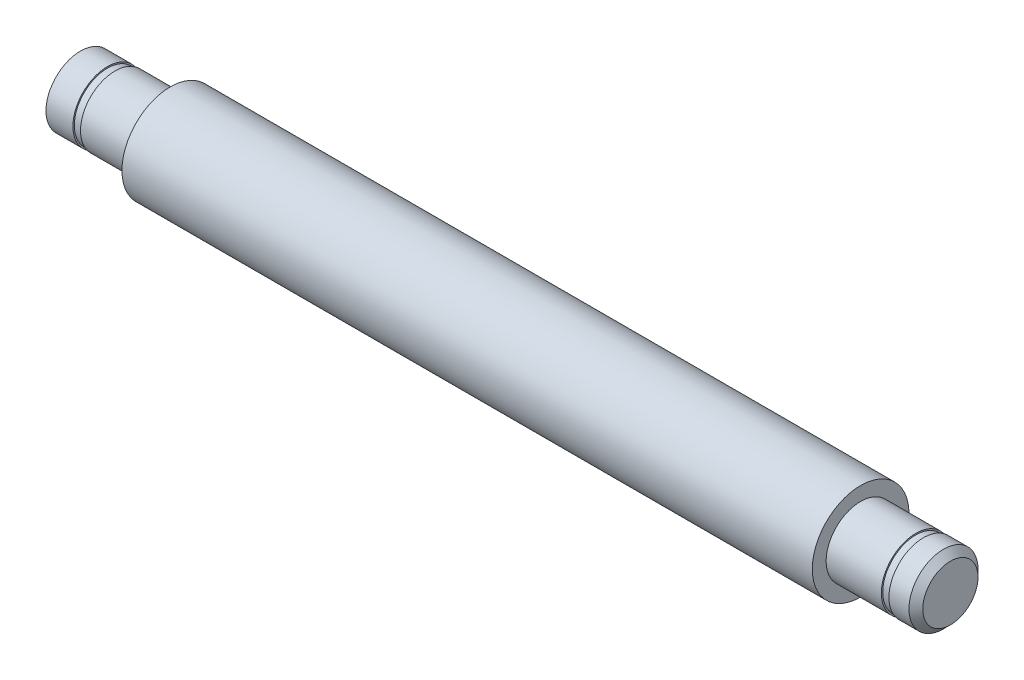
ISO-10303-21;
HEADER;
FILE_DESCRIPTION(('STEP AP214'),'2;1');
FILE_NAME('part.step','',(''),(''),'','','');
FILE_SCHEMA(('AUTOMOTIVE_DESIGN { 1 0 10303 214 1 1 1 1 }'));
ENDSEC;
DATA;
#1=APPLICATION_CONTEXT('core data for automotive mechanical design processes');
#2=APPLICATION_PROTOCOL_DEFINITION('international standard','automotive_design',2000,#1);
#3=PRODUCT_CONTEXT('',#1,'mechanical');
#4=PRODUCT('Part','Part','',(#3));
#5=PRODUCT_RELATED_PRODUCT_CATEGORY('part','',(#4));
#6=PRODUCT_DEFINITION_FORMATION('','',#4);
#7=PRODUCT_DEFINITION_CONTEXT('part definition',#1,'design');
#8=PRODUCT_DEFINITION('design','',#6,#7);
#9=PRODUCT_DEFINITION_SHAPE('','',#8);
#10=(LENGTH_UNIT() NAMED_UNIT(*) SI_UNIT(.MILLI.,.METRE.));
#11=(NAMED_UNIT(*) PLANE_ANGLE_UNIT() SI_UNIT($,.RADIAN.));
#12=(NAMED_UNIT(*) SI_UNIT($,.STERADIAN.) SOLID_ANGLE_UNIT());
#13=UNCERTAINTY_MEASURE_WITH_UNIT(LENGTH_MEASURE(1.E-05),#10,'distance_accuracy_value','');
#14=(GEOMETRIC_REPRESENTATION_CONTEXT(3) GLOBAL_UNCERTAINTY_ASSIGNED_CONTEXT((#13)) GLOBAL_UNIT_ASSIGNED_CONTEXT((#10,
#11,#12)) REPRESENTATION_CONTEXT('',''));
#15=CARTESIAN_POINT('',(0.,0.,0.));
#16=DIRECTION('',(0.,0.,1.));
#17=DIRECTION('',(1.,0.,0.));
#18=AXIS2_PLACEMENT_3D('',#15,#16,#17);
#19=CARTESIAN_POINT('',(-125.234019669191,0.,0.));
#20=DIRECTION('',(-1.,0.,0.));
#21=DIRECTION('',(0.,0.,1.));
#22=AXIS2_PLACEMENT_3D('',#19,#20,#21);
#23=CYLINDRICAL_SURFACE('',#22,4.99999999999996);
#24=CARTESIAN_POINT('',(57.9999999999997,0.,0.));
#25=DIRECTION('',(-1.,0.,0.));
#26=DIRECTION('',(0.,0.,1.));
#27=AXIS2_PLACEMENT_3D('',#24,#25,#26);
#28=CIRCLE('',#27,4.99999999999996);
#29=CARTESIAN_POINT('',(57.9999999999997,0.,4.99999999999996));
#30=VERTEX_POINT('',#29);
#31=EDGE_CURVE('E70',#30,#30,#28,.T.);
#32=ORIENTED_EDGE('',*,*,#31,.T.);
#33=EDGE_LOOP('',(#32));
#34=FACE_BOUND('',#33,.T.);
#35=CARTESIAN_POINT('',(50.,0.,0.));
#36=DIRECTION('',(-1.,0.,0.));
#37=DIRECTION('',(0.,0.,1.));
#38=AXIS2_PLACEMENT_3D('',#35,#36,#37);
#39=CIRCLE('',#38,4.99999999999996);
#40=CARTESIAN_POINT('',(50.,0.,4.99999999999996));
#41=VERTEX_POINT('',#40);
#42=EDGE_CURVE('E61',#41,#41,#39,.T.);
#43=ORIENTED_EDGE('',*,*,#42,.F.);
#44=EDGE_LOOP('',(#43));
#45=FACE_BOUND('',#44,.T.);
#46=ADVANCED_FACE('F40',(#34,#45),#23,.T.);
#47=CARTESIAN_POINT('',(-50.,0.,4.99999999999997));
#48=DIRECTION('',(-1.,0.,0.));
#49=DIRECTION('',(0.,0.,1.));
#50=AXIS2_PLACEMENT_3D('',#47,#48,#49);
#51=PLANE('',#50);
#52=CARTESIAN_POINT('',(-50.,0.,0.));
#53=DIRECTION('',(-1.,0.,0.));
#54=DIRECTION('',(0.,0.,1.));
#55=AXIS2_PLACEMENT_3D('',#52,#53,#54);
#56=CIRCLE('',#55,7.);
#57=CARTESIAN_POINT('',(-50.,0.,7.));
#58=VERTEX_POINT('',#57);
#59=EDGE_CURVE('E52',#58,#58,#56,.T.);
#60=ORIENTED_EDGE('',*,*,#59,.T.);
#61=EDGE_LOOP('',(#60));
#62=FACE_BOUND('',#61,.T.);
#63=CARTESIAN_POINT('',(-50.,0.,0.));
#64=DIRECTION('',(-1.,0.,0.));
#65=DIRECTION('',(0.,0.,1.));
#66=AXIS2_PLACEMENT_3D('',#63,#64,#65);
#67=CIRCLE('',#66,4.99999999999997);
#68=CARTESIAN_POINT('',(-50.,0.,4.99999999999997));
#69=VERTEX_POINT('',#68);
#70=EDGE_CURVE('E67',#69,#69,#67,.T.);
#71=ORIENTED_EDGE('',*,*,#70,.F.);
#72=EDGE_LOOP('',(#71));
#73=FACE_BOUND('',#72,.T.);
#74=ADVANCED_FACE('F109',(#62,#73),#51,.T.);
#75=CARTESIAN_POINT('',(-125.234019669191,0.,0.));
#76=DIRECTION('',(-1.,0.,0.));
#77=DIRECTION('',(0.,0.,1.));
#78=AXIS2_PLACEMENT_3D('',#75,#76,#77);
#79=CYLINDRICAL_SURFACE('',#78,6.99999999999999);
#80=CARTESIAN_POINT('',(50.,0.,0.));
#81=DIRECTION('',(-1.,0.,0.));
#82=DIRECTION('',(0.,0.,1.));
#83=AXIS2_PLACEMENT_3D('',#80,#81,#82);
#84=CIRCLE('',#83,6.99999999999999);
#85=CARTESIAN_POINT('',(50.,0.,6.99999999999999));
#86=VERTEX_POINT('',#85);
#87=EDGE_CURVE('E56',#86,#86,#84,.T.);
#88=ORIENTED_EDGE('',*,*,#87,.T.);
#89=EDGE_LOOP('',(#88));
#90=FACE_BOUND('',#89,.T.);
#91=ORIENTED_EDGE('',*,*,#59,.F.);
#92=EDGE_LOOP('',(#91));
#93=FACE_BOUND('',#92,.T.);
#94=ADVANCED_FACE('F116',(#90,#93),#79,.T.);
#95=CARTESIAN_POINT('',(50.,0.,6.99999999999999));
#96=DIRECTION('',(1.,0.,0.));
#97=DIRECTION('',(0.,0.,-1.));
#98=AXIS2_PLACEMENT_3D('',#95,#96,#97);
#99=PLANE('',#98);
#100=ORIENTED_EDGE('',*,*,#42,.T.);
#101=EDGE_LOOP('',(#100));
#102=FACE_BOUND('',#101,.T.);
#103=ORIENTED_EDGE('',*,*,#87,.F.);
#104=EDGE_LOOP('',(#103));
#105=FACE_BOUND('',#104,.T.);
#106=ADVANCED_FACE('F122',(#102,#105),#99,.T.);
#107=CARTESIAN_POINT('',(-125.234019669191,0.,0.));
#108=DIRECTION('',(-1.,0.,0.));
#109=DIRECTION('',(0.,0.,1.));
#110=AXIS2_PLACEMENT_3D('',#107,#108,#109);
#111=CYLINDRICAL_SURFACE('',#110,4.99999999999993);
#112=CARTESIAN_POINT('',(-57.9999999999997,0.,0.));
#113=DIRECTION('',(-1.,0.,0.));
#114=DIRECTION('',(0.,0.,1.));
#115=AXIS2_PLACEMENT_3D('',#112,#113,#114);
#116=CIRCLE('',#115,4.99999999999996);
#117=CARTESIAN_POINT('',(-57.9999999999997,0.,4.99999999999996));
#118=VERTEX_POINT('',#117);
#119=EDGE_CURVE('E75',#118,#118,#116,.T.);
#120=ORIENTED_EDGE('',*,*,#119,.F.);
#121=EDGE_LOOP('',(#120));
#122=FACE_BOUND('',#121,.T.);
#123=ORIENTED_EDGE('',*,*,#70,.T.);
#124=EDGE_LOOP('',(#123));
#125=FACE_BOUND('',#124,.T.);
#126=ADVANCED_FACE('F125',(#122,#125),#111,.T.);
#127=CARTESIAN_POINT('',(-59.0999999999997,0.,4.8));
#128=DIRECTION('',(-1.,0.,0.));
#129=DIRECTION('',(0.,0.,1.));
#130=AXIS2_PLACEMENT_3D('',#127,#128,#129);
#131=PLANE('',#130);
#132=CARTESIAN_POINT('',(-59.0999999999997,0.,0.));
#133=DIRECTION('',(-1.,0.,0.));
#134=DIRECTION('',(0.,0.,1.));
#135=AXIS2_PLACEMENT_3D('',#132,#133,#134);
#136=CIRCLE('',#135,4.99999999999996);
#137=CARTESIAN_POINT('',(-59.0999999999997,0.,4.99999999999996));
#138=VERTEX_POINT('',#137);
#139=EDGE_CURVE('E71',#138,#138,#136,.T.);
#140=ORIENTED_EDGE('',*,*,#139,.F.);
#141=EDGE_LOOP('',(#140));
#142=FACE_BOUND('',#141,.T.);
#143=CARTESIAN_POINT('',(-59.0999999999997,0.,0.));
#144=DIRECTION('',(-1.,0.,0.));
#145=DIRECTION('',(0.,0.,1.));
#146=AXIS2_PLACEMENT_3D('',#143,#144,#145);
#147=CIRCLE('',#146,4.8);
#148=CARTESIAN_POINT('',(-59.0999999999997,0.,4.8));
#149=VERTEX_POINT('',#148);
#150=EDGE_CURVE('E81',#149,#149,#147,.T.);
#151=ORIENTED_EDGE('',*,*,#150,.T.);
#152=EDGE_LOOP('',(#151));
#153=FACE_BOUND('',#152,.T.);
#154=ADVANCED_FACE('F135',(#142,#153),#131,.F.);
#155=CARTESIAN_POINT('',(-57.9999999999997,0.,4.99999999999996));
#156=DIRECTION('',(1.,0.,0.));
#157=DIRECTION('',(0.,0.,-1.));
#158=AXIS2_PLACEMENT_3D('',#155,#156,#157);
#159=PLANE('',#158);
#160=CARTESIAN_POINT('',(-57.9999999999997,0.,0.));
#161=DIRECTION('',(-1.,0.,0.));
#162=DIRECTION('',(0.,0.,1.));
#163=AXIS2_PLACEMENT_3D('',#160,#161,#162);
#164=CIRCLE('',#163,4.8);
#165=CARTESIAN_POINT('',(-57.9999999999997,0.,4.8));
#166=VERTEX_POINT('',#165);
#167=EDGE_CURVE('E78',#166,#166,#164,.T.);
#168=ORIENTED_EDGE('',*,*,#167,.F.);
#169=EDGE_LOOP('',(#168));
#170=FACE_BOUND('',#169,.T.);
#171=ORIENTED_EDGE('',*,*,#119,.T.);
#172=EDGE_LOOP('',(#171));
#173=FACE_BOUND('',#172,.T.);
#174=ADVANCED_FACE('F142',(#170,#173),#159,.F.);
#175=CARTESIAN_POINT('',(0.,0.,0.));
#176=DIRECTION('',(-1.,0.,0.));
#177=DIRECTION('',(0.,0.,1.));
#178=AXIS2_PLACEMENT_3D('',#175,#176,#177);
#179=CYLINDRICAL_SURFACE('',#178,4.8);
#180=ORIENTED_EDGE('',*,*,#150,.F.);
#181=EDGE_LOOP('',(#180));
#182=FACE_BOUND('',#181,.T.);
#183=ORIENTED_EDGE('',*,*,#167,.T.);
#184=EDGE_LOOP('',(#183));
#185=FACE_BOUND('',#184,.T.);
#186=ADVANCED_FACE('F158',(#182,#185),#179,.T.);
#187=CARTESIAN_POINT('',(-63.,0.,4.99999999999988));
#188=DIRECTION('',(-1.,0.,0.));
#189=DIRECTION('',(0.,0.,1.));
#190=AXIS2_PLACEMENT_3D('',#187,#188,#189);
#191=PLANE('',#190);
#192=CARTESIAN_POINT('',(-63.,0.,0.));
#193=DIRECTION('',(-1.,0.,0.));
#194=DIRECTION('',(0.,0.,1.));
#195=AXIS2_PLACEMENT_3D('',#192,#193,#194);
#196=CIRCLE('',#195,4.99999999999988);
#197=CARTESIAN_POINT('',(-63.,0.,4.99999999999988));
#198=VERTEX_POINT('',#197);
#199=EDGE_CURVE('E64',#198,#198,#196,.T.);
#200=ORIENTED_EDGE('',*,*,#199,.T.);
#201=EDGE_LOOP('',(#200));
#202=FACE_BOUND('',#201,.T.);
#203=ADVANCED_FACE('F149',(#202),#191,.T.);
#204=ORIENTED_EDGE('',*,*,#139,.T.);
#205=EDGE_LOOP('',(#204));
#206=FACE_BOUND('',#205,.T.);
#207=ORIENTED_EDGE('',*,*,#199,.F.);
#208=EDGE_LOOP('',(#207));
#209=FACE_BOUND('',#208,.T.);
#210=ADVANCED_FACE('F138',(#206,#209),#111,.T.);
#211=CARTESIAN_POINT('',(57.9999999999997,0.,4.99999999999996));
#212=DIRECTION('',(-1.,0.,0.));
#213=DIRECTION('',(0.,0.,1.));
#214=AXIS2_PLACEMENT_3D('',#211,#212,#213);
#215=PLANE('',#214);
#216=ORIENTED_EDGE('',*,*,#31,.F.);
#217=EDGE_LOOP('',(#216));
#218=FACE_BOUND('',#217,.T.);
#219=CARTESIAN_POINT('',(57.9999999999997,0.,0.));
#220=DIRECTION('',(-1.,0.,0.));
#221=DIRECTION('',(0.,0.,1.));
#222=AXIS2_PLACEMENT_3D('',#219,#220,#221);
#223=CIRCLE('',#222,4.8);
#224=CARTESIAN_POINT('',(57.9999999999997,0.,4.8));
#225=VERTEX_POINT('',#224);
#226=EDGE_CURVE('E86',#225,#225,#223,.T.);
#227=ORIENTED_EDGE('',*,*,#226,.T.);
#228=EDGE_LOOP('',(#227));
#229=FACE_BOUND('',#228,.T.);
#230=ADVANCED_FACE('F148',(#218,#229),#215,.F.);
#231=CARTESIAN_POINT('',(0.,0.,0.));
#232=DIRECTION('',(-1.,0.,0.));
#233=DIRECTION('',(0.,0.,1.));
#234=AXIS2_PLACEMENT_3D('',#231,#232,#233);
#235=CYLINDRICAL_SURFACE('',#234,4.8);
#236=ORIENTED_EDGE('',*,*,#226,.F.);
#237=EDGE_LOOP('',(#236));
#238=FACE_BOUND('',#237,.T.);
#239=CARTESIAN_POINT('',(59.0999999999997,0.,0.));
#240=DIRECTION('',(-1.,0.,0.));
#241=DIRECTION('',(0.,0.,1.));
#242=AXIS2_PLACEMENT_3D('',#239,#240,#241);
#243=CIRCLE('',#242,4.8);
#244=CARTESIAN_POINT('',(59.0999999999997,0.,4.8));
#245=VERTEX_POINT('',#244);
#246=EDGE_CURVE('E89',#245,#245,#243,.T.);
#247=ORIENTED_EDGE('',*,*,#246,.T.);
#248=EDGE_LOOP('',(#247));
#249=FACE_BOUND('',#248,.T.);
#250=ADVANCED_FACE('F155',(#238,#249),#235,.T.);
#251=CARTESIAN_POINT('',(59.0999999999997,0.,4.8));
#252=DIRECTION('',(1.,0.,0.));
#253=DIRECTION('',(0.,0.,-1.));
#254=AXIS2_PLACEMENT_3D('',#251,#252,#253);
#255=PLANE('',#254);
#256=ORIENTED_EDGE('',*,*,#246,.F.);
#257=EDGE_LOOP('',(#256));
#258=FACE_BOUND('',#257,.T.);
#259=CARTESIAN_POINT('',(59.0999999999997,0.,0.));
#260=DIRECTION('',(-1.,0.,0.));
#261=DIRECTION('',(0.,0.,1.));
#262=AXIS2_PLACEMENT_3D('',#259,#260,#261);
#263=CIRCLE('',#262,4.99999999999996);
#264=CARTESIAN_POINT('',(59.0999999999997,0.,4.99999999999996));
#265=VERTEX_POINT('',#264);
#266=EDGE_CURVE('E74',#265,#265,#263,.T.);
#267=ORIENTED_EDGE('',*,*,#266,.T.);
#268=EDGE_LOOP('',(#267));
#269=FACE_BOUND('',#268,.T.);
#270=ADVANCED_FACE('F95',(#258,#269),#255,.F.);
#271=CARTESIAN_POINT('',(63.,0.,4.99999999999996));
#272=DIRECTION('',(1.,0.,0.));
#273=DIRECTION('',(0.,0.,-1.));
#274=AXIS2_PLACEMENT_3D('',#271,#272,#273);
#275=PLANE('',#274);
#276=CARTESIAN_POINT('',(63.,0.,0.));
#277=DIRECTION('',(1.,0.,0.));
#278=DIRECTION('',(0.,0.,-1.));
#279=AXIS2_PLACEMENT_3D('',#276,#277,#278);
#280=CIRCLE('',#279,3.99999999999993);
#281=CARTESIAN_POINT('',(63.,0.,-3.99999999999993));
#282=VERTEX_POINT('',#281);
#283=EDGE_CURVE('E11',#282,#282,#280,.T.);
#284=ORIENTED_EDGE('',*,*,#283,.T.);
#285=EDGE_LOOP('',(#284));
#286=FACE_BOUND('',#285,.T.);
#287=ADVANCED_FACE('F99',(#286),#275,.T.);
#288=CARTESIAN_POINT('',(61.9999999999999,0.,0.));
#289=DIRECTION('',(1.,0.,0.));
#290=DIRECTION('',(0.,0.,-1.));
#291=AXIS2_PLACEMENT_3D('',#288,#289,#290);
#292=CIRCLE('',#291,4.99999999999996);
#293=CARTESIAN_POINT('',(61.9999999999999,0.,-4.99999999999996));
#294=VERTEX_POINT('',#293);
#295=EDGE_CURVE('E48',#294,#294,#292,.F.);
#296=ORIENTED_EDGE('',*,*,#295,.T.);
#297=EDGE_LOOP('',(#296));
#298=FACE_BOUND('',#297,.T.);
#299=ORIENTED_EDGE('',*,*,#266,.F.);
#300=EDGE_LOOP('',(#299));
#301=FACE_BOUND('',#300,.T.);
#302=ADVANCED_FACE('F97',(#298,#301),#23,.T.);
#303=CARTESIAN_POINT('',(61.9999999999999,0.,0.));
#304=DIRECTION('',(-1.,0.,0.));
#305=DIRECTION('',(0.,0.,1.));
#306=AXIS2_PLACEMENT_3D('',#303,#304,#305);
#307=CONICAL_SURFACE('',#306,4.99999999999996,0.785398163397432);
#308=ORIENTED_EDGE('',*,*,#283,.F.);
#309=EDGE_LOOP('',(#308));
#310=FACE_BOUND('',#309,.T.);
#311=ORIENTED_EDGE('',*,*,#295,.F.);
#312=EDGE_LOOP('',(#311));
#313=FACE_BOUND('',#312,.T.);
#314=ADVANCED_FACE('F43',(#310,#313),#307,.T.);
#315=CLOSED_SHELL('',(#46,#74,#94,#106,#126,#154,#174,#186,#203,#210,#230,#250,#270,#287,#302,#314));
#316=MANIFOLD_SOLID_BREP('B2',#315);
#317=ADVANCED_BREP_SHAPE_REPRESENTATION('',(#18,#316),#14);
#318=SHAPE_DEFINITION_REPRESENTATION(#9,#317);
ENDSEC;
END-ISO-10303-21;
